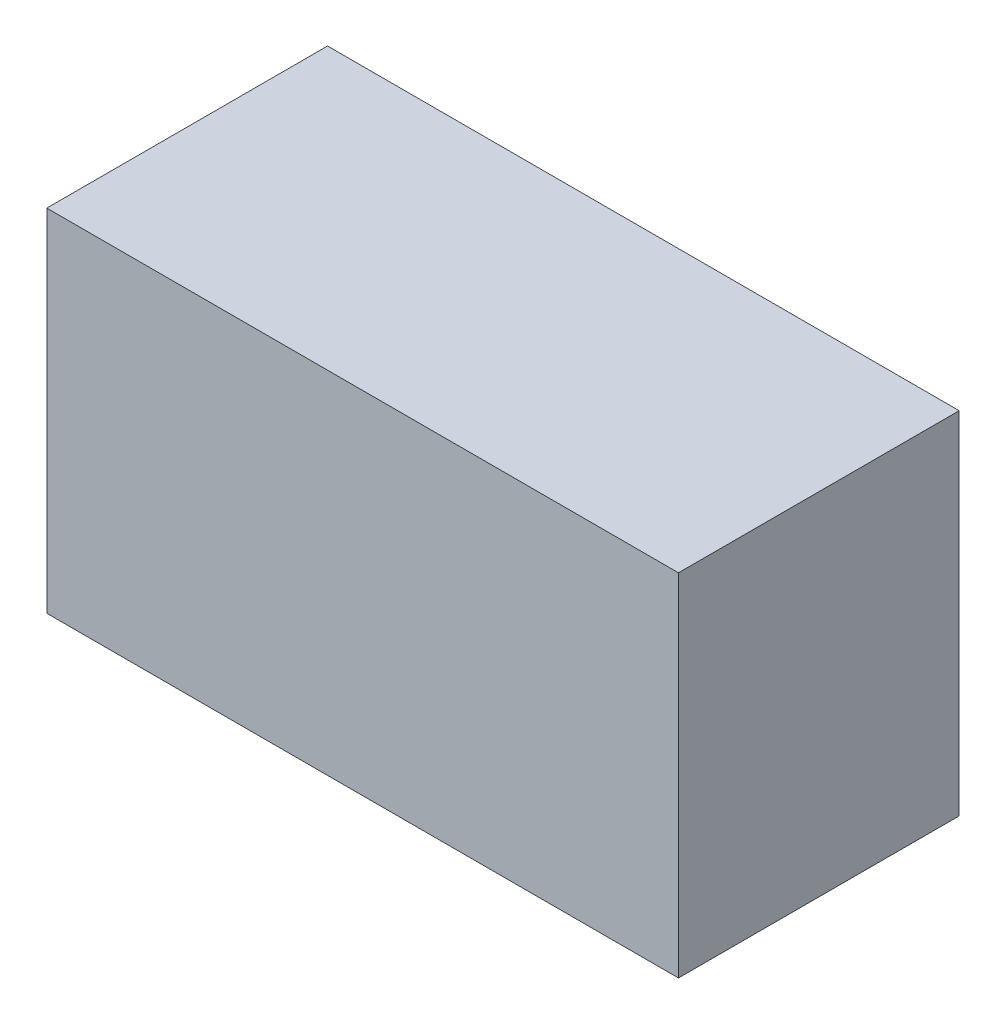
ISO-10303-21;
HEADER;
FILE_DESCRIPTION(('STEP AP214'),'2;1');
FILE_NAME('part.step','',(''),(''),'','','');
FILE_SCHEMA(('AUTOMOTIVE_DESIGN { 1 0 10303 214 1 1 1 1 }'));
ENDSEC;
DATA;
#1=APPLICATION_CONTEXT('core data for automotive mechanical design processes');
#2=APPLICATION_PROTOCOL_DEFINITION('international standard','automotive_design',2000,#1);
#3=PRODUCT_CONTEXT('',#1,'mechanical');
#4=PRODUCT('Part','Part','',(#3));
#5=PRODUCT_RELATED_PRODUCT_CATEGORY('part','',(#4));
#6=PRODUCT_DEFINITION_FORMATION('','',#4);
#7=PRODUCT_DEFINITION_CONTEXT('part definition',#1,'design');
#8=PRODUCT_DEFINITION('design','',#6,#7);
#9=PRODUCT_DEFINITION_SHAPE('','',#8);
#10=(LENGTH_UNIT() NAMED_UNIT(*) SI_UNIT(.MILLI.,.METRE.));
#11=(NAMED_UNIT(*) PLANE_ANGLE_UNIT() SI_UNIT($,.RADIAN.));
#12=(NAMED_UNIT(*) SI_UNIT($,.STERADIAN.) SOLID_ANGLE_UNIT());
#13=UNCERTAINTY_MEASURE_WITH_UNIT(LENGTH_MEASURE(1.E-05),#10,'distance_accuracy_value','');
#14=(GEOMETRIC_REPRESENTATION_CONTEXT(3) GLOBAL_UNCERTAINTY_ASSIGNED_CONTEXT((#13)) GLOBAL_UNIT_ASSIGNED_CONTEXT((#10,
#11,#12)) REPRESENTATION_CONTEXT('',''));
#15=CARTESIAN_POINT('',(0.,0.,0.));
#16=DIRECTION('',(0.,0.,1.));
#17=DIRECTION('',(1.,0.,0.));
#18=AXIS2_PLACEMENT_3D('',#15,#16,#17);
#19=CARTESIAN_POINT('',(22.5,25.,-10.));
#20=DIRECTION('',(-1.,0.,0.));
#21=DIRECTION('',(0.,0.,1.));
#22=AXIS2_PLACEMENT_3D('',#19,#20,#21);
#23=PLANE('',#22);
#24=DIRECTION('',(0.,0.,-1.));
#25=VECTOR('',#24,1.);
#26=CARTESIAN_POINT('',(22.5,0.,-10.));
#27=LINE('',#26,#25);
#28=CARTESIAN_POINT('',(22.5,0.,10.));
#29=VERTEX_POINT('',#28);
#30=CARTESIAN_POINT('',(22.5,0.,-10.));
#31=VERTEX_POINT('',#30);
#32=EDGE_CURVE('E113',#29,#31,#27,.T.);
#33=ORIENTED_EDGE('',*,*,#32,.T.);
#34=DIRECTION('',(0.,-1.,0.));
#35=VECTOR('',#34,1.);
#36=CARTESIAN_POINT('',(22.5,25.,-10.));
#37=LINE('',#36,#35);
#38=CARTESIAN_POINT('',(22.5,25.,-10.));
#39=VERTEX_POINT('',#38);
#40=EDGE_CURVE('E11',#39,#31,#37,.T.);
#41=ORIENTED_EDGE('',*,*,#40,.F.);
#42=DIRECTION('',(0.,0.,-1.));
#43=VECTOR('',#42,1.);
#44=CARTESIAN_POINT('',(22.5,25.,-10.));
#45=LINE('',#44,#43);
#46=CARTESIAN_POINT('',(22.5,25.,10.));
#47=VERTEX_POINT('',#46);
#48=EDGE_CURVE('E97',#47,#39,#45,.T.);
#49=ORIENTED_EDGE('',*,*,#48,.F.);
#50=DIRECTION('',(0.,-1.,0.));
#51=VECTOR('',#50,1.);
#52=CARTESIAN_POINT('',(22.5,25.,10.));
#53=LINE('',#52,#51);
#54=EDGE_CURVE('E109',#47,#29,#53,.T.);
#55=ORIENTED_EDGE('',*,*,#54,.T.);
#56=EDGE_LOOP('',(#33,#41,#49,#55));
#57=FACE_BOUND('',#56,.T.);
#58=ADVANCED_FACE('F45',(#57),#23,.F.);
#59=CARTESIAN_POINT('',(-22.5,25.,-10.));
#60=DIRECTION('',(0.,0.,1.));
#61=DIRECTION('',(1.,0.,0.));
#62=AXIS2_PLACEMENT_3D('',#59,#60,#61);
#63=PLANE('',#62);
#64=DIRECTION('',(-1.,0.,0.));
#65=VECTOR('',#64,1.);
#66=CARTESIAN_POINT('',(-22.5,0.,-10.));
#67=LINE('',#66,#65);
#68=CARTESIAN_POINT('',(-22.5,0.,-10.));
#69=VERTEX_POINT('',#68);
#70=EDGE_CURVE('E102',#31,#69,#67,.T.);
#71=ORIENTED_EDGE('',*,*,#70,.T.);
#72=DIRECTION('',(0.,-1.,0.));
#73=VECTOR('',#72,1.);
#74=CARTESIAN_POINT('',(-22.5,25.,-10.));
#75=LINE('',#74,#73);
#76=CARTESIAN_POINT('',(-22.5,25.,-10.));
#77=VERTEX_POINT('',#76);
#78=EDGE_CURVE('E54',#77,#69,#75,.T.);
#79=ORIENTED_EDGE('',*,*,#78,.F.);
#80=DIRECTION('',(-1.,0.,0.));
#81=VECTOR('',#80,1.);
#82=CARTESIAN_POINT('',(-22.5,25.,-10.));
#83=LINE('',#82,#81);
#84=EDGE_CURVE('E92',#39,#77,#83,.T.);
#85=ORIENTED_EDGE('',*,*,#84,.F.);
#86=ORIENTED_EDGE('',*,*,#40,.T.);
#87=EDGE_LOOP('',(#71,#79,#85,#86));
#88=FACE_BOUND('',#87,.T.);
#89=ADVANCED_FACE('F101',(#88),#63,.F.);
#90=CARTESIAN_POINT('',(-22.5,25.,-10.));
#91=DIRECTION('',(1.,0.,0.));
#92=DIRECTION('',(0.,0.,-1.));
#93=AXIS2_PLACEMENT_3D('',#90,#91,#92);
#94=PLANE('',#93);
#95=DIRECTION('',(0.,0.,1.));
#96=VECTOR('',#95,1.);
#97=CARTESIAN_POINT('',(-22.5,0.,-10.));
#98=LINE('',#97,#96);
#99=CARTESIAN_POINT('',(-22.5,0.,10.));
#100=VERTEX_POINT('',#99);
#101=EDGE_CURVE('E79',#69,#100,#98,.T.);
#102=ORIENTED_EDGE('',*,*,#101,.T.);
#103=DIRECTION('',(0.,-1.,0.));
#104=VECTOR('',#103,1.);
#105=CARTESIAN_POINT('',(-22.5,25.,10.));
#106=LINE('',#105,#104);
#107=CARTESIAN_POINT('',(-22.5,25.,10.));
#108=VERTEX_POINT('',#107);
#109=EDGE_CURVE('E104',#108,#100,#106,.T.);
#110=ORIENTED_EDGE('',*,*,#109,.F.);
#111=DIRECTION('',(0.,0.,1.));
#112=VECTOR('',#111,1.);
#113=CARTESIAN_POINT('',(-22.5,25.,-10.));
#114=LINE('',#113,#112);
#115=EDGE_CURVE('E95',#77,#108,#114,.T.);
#116=ORIENTED_EDGE('',*,*,#115,.F.);
#117=ORIENTED_EDGE('',*,*,#78,.T.);
#118=EDGE_LOOP('',(#102,#110,#116,#117));
#119=FACE_BOUND('',#118,.T.);
#120=ADVANCED_FACE('F105',(#119),#94,.F.);
#121=CARTESIAN_POINT('',(-22.5,25.,10.));
#122=DIRECTION('',(0.,0.,-1.));
#123=DIRECTION('',(-1.,0.,0.));
#124=AXIS2_PLACEMENT_3D('',#121,#122,#123);
#125=PLANE('',#124);
#126=DIRECTION('',(1.,0.,0.));
#127=VECTOR('',#126,1.);
#128=CARTESIAN_POINT('',(-22.5,0.,10.));
#129=LINE('',#128,#127);
#130=EDGE_CURVE('E85',#100,#29,#129,.T.);
#131=ORIENTED_EDGE('',*,*,#130,.T.);
#132=ORIENTED_EDGE('',*,*,#54,.F.);
#133=DIRECTION('',(1.,0.,0.));
#134=VECTOR('',#133,1.);
#135=CARTESIAN_POINT('',(-22.5,25.,10.));
#136=LINE('',#135,#134);
#137=EDGE_CURVE('E62',#108,#47,#136,.T.);
#138=ORIENTED_EDGE('',*,*,#137,.F.);
#139=ORIENTED_EDGE('',*,*,#109,.T.);
#140=EDGE_LOOP('',(#131,#132,#138,#139));
#141=FACE_BOUND('',#140,.T.);
#142=ADVANCED_FACE('F126',(#141),#125,.F.);
#143=CARTESIAN_POINT('',(0.,25.,0.));
#144=DIRECTION('',(0.,1.,0.));
#145=DIRECTION('',(0.,0.,1.));
#146=AXIS2_PLACEMENT_3D('',#143,#144,#145);
#147=PLANE('',#146);
#148=ORIENTED_EDGE('',*,*,#48,.T.);
#149=ORIENTED_EDGE('',*,*,#84,.T.);
#150=ORIENTED_EDGE('',*,*,#115,.T.);
#151=ORIENTED_EDGE('',*,*,#137,.T.);
#152=EDGE_LOOP('',(#148,#149,#150,#151));
#153=FACE_BOUND('',#152,.T.);
#154=ADVANCED_FACE('F93',(#153),#147,.T.);
#155=CARTESIAN_POINT('',(0.,0.,0.));
#156=DIRECTION('',(0.,1.,0.));
#157=DIRECTION('',(0.,0.,1.));
#158=AXIS2_PLACEMENT_3D('',#155,#156,#157);
#159=PLANE('',#158);
#160=ORIENTED_EDGE('',*,*,#32,.F.);
#161=ORIENTED_EDGE('',*,*,#130,.F.);
#162=ORIENTED_EDGE('',*,*,#101,.F.);
#163=ORIENTED_EDGE('',*,*,#70,.F.);
#164=EDGE_LOOP('',(#160,#161,#162,#163));
#165=FACE_BOUND('',#164,.T.);
#166=ADVANCED_FACE('F129',(#165),#159,.F.);
#167=CLOSED_SHELL('',(#58,#89,#120,#142,#154,#166));
#168=MANIFOLD_SOLID_BREP('B2',#167);
#169=ADVANCED_BREP_SHAPE_REPRESENTATION('',(#18,#168),#14);
#170=SHAPE_DEFINITION_REPRESENTATION(#9,#169);
ENDSEC;
END-ISO-10303-21;
